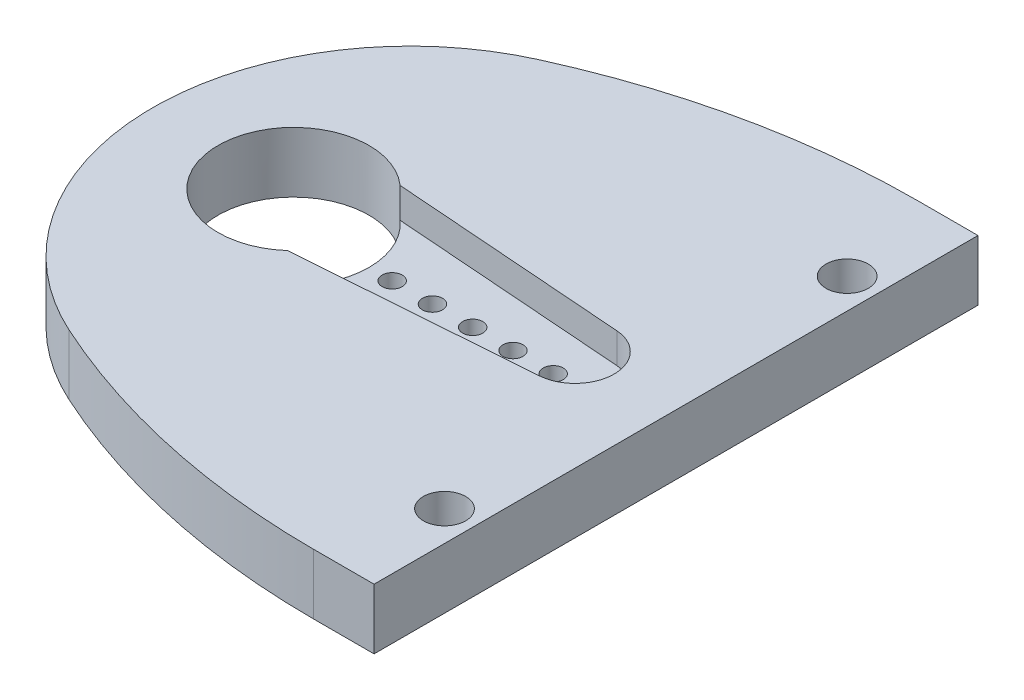
ISO-10303-21;
HEADER;
FILE_DESCRIPTION(('STEP AP214'),'2;1');
FILE_NAME('part.step','',(''),(''),'','','');
FILE_SCHEMA(('AUTOMOTIVE_DESIGN { 1 0 10303 214 1 1 1 1 }'));
ENDSEC;
DATA;
#1=APPLICATION_CONTEXT('core data for automotive mechanical design processes');
#2=APPLICATION_PROTOCOL_DEFINITION('international standard','automotive_design',2000,#1);
#3=PRODUCT_CONTEXT('',#1,'mechanical');
#4=PRODUCT('Part','Part','',(#3));
#5=PRODUCT_RELATED_PRODUCT_CATEGORY('part','',(#4));
#6=PRODUCT_DEFINITION_FORMATION('','',#4);
#7=PRODUCT_DEFINITION_CONTEXT('part definition',#1,'design');
#8=PRODUCT_DEFINITION('design','',#6,#7);
#9=PRODUCT_DEFINITION_SHAPE('','',#8);
#10=(LENGTH_UNIT() NAMED_UNIT(*) SI_UNIT(.MILLI.,.METRE.));
#11=(NAMED_UNIT(*) PLANE_ANGLE_UNIT() SI_UNIT($,.RADIAN.));
#12=(NAMED_UNIT(*) SI_UNIT($,.STERADIAN.) SOLID_ANGLE_UNIT());
#13=UNCERTAINTY_MEASURE_WITH_UNIT(LENGTH_MEASURE(1.E-05),#10,'distance_accuracy_value','');
#14=(GEOMETRIC_REPRESENTATION_CONTEXT(3) GLOBAL_UNCERTAINTY_ASSIGNED_CONTEXT((#13)) GLOBAL_UNIT_ASSIGNED_CONTEXT((#10,
#11,#12)) REPRESENTATION_CONTEXT('',''));
#15=CARTESIAN_POINT('',(0.,0.,0.));
#16=DIRECTION('',(0.,0.,1.));
#17=DIRECTION('',(1.,0.,0.));
#18=AXIS2_PLACEMENT_3D('',#15,#16,#17);
#19=CARTESIAN_POINT('',(16.,-3.,22.4770601851531));
#20=DIRECTION('',(0.,1.,0.));
#21=DIRECTION('',(0.,0.,1.));
#22=AXIS2_PLACEMENT_3D('',#19,#20,#21);
#23=CYLINDRICAL_SURFACE('',#22,37.4770601851531);
#24=CARTESIAN_POINT('',(16.,0.,22.4770601851531));
#25=DIRECTION('',(0.,1.,0.));
#26=DIRECTION('',(0.,0.,1.));
#27=AXIS2_PLACEMENT_3D('',#24,#25,#26);
#28=CIRCLE('',#27,37.4770601851531);
#29=CARTESIAN_POINT('',(16.,0.,-15.));
#30=VERTEX_POINT('',#29);
#31=CARTESIAN_POINT('',(0.500000000000023,0.,-11.644487847162));
#32=VERTEX_POINT('',#31);
#33=EDGE_CURVE('E143',#30,#32,#28,.T.);
#34=ORIENTED_EDGE('',*,*,#33,.F.);
#35=DIRECTION('',(0.,1.,0.));
#36=VECTOR('',#35,1.);
#37=CARTESIAN_POINT('',(16.,-3.,-15.));
#38=LINE('',#37,#36);
#39=CARTESIAN_POINT('',(16.,-3.,-15.));
#40=VERTEX_POINT('',#39);
#41=EDGE_CURVE('E11',#40,#30,#38,.T.);
#42=ORIENTED_EDGE('',*,*,#41,.F.);
#43=CARTESIAN_POINT('',(16.,-3.,22.4770601851531));
#44=DIRECTION('',(0.,1.,0.));
#45=DIRECTION('',(0.,0.,1.));
#46=AXIS2_PLACEMENT_3D('',#43,#44,#45);
#47=CIRCLE('',#46,37.4770601851531);
#48=CARTESIAN_POINT('',(0.500000000000023,-3.,-11.644487847162));
#49=VERTEX_POINT('',#48);
#50=EDGE_CURVE('E163',#40,#49,#47,.T.);
#51=ORIENTED_EDGE('',*,*,#50,.T.);
#52=DIRECTION('',(0.,1.,0.));
#53=VECTOR('',#52,1.);
#54=CARTESIAN_POINT('',(0.500000000000023,-3.,-11.644487847162));
#55=LINE('',#54,#53);
#56=EDGE_CURVE('E93',#49,#32,#55,.T.);
#57=ORIENTED_EDGE('',*,*,#56,.T.);
#58=EDGE_LOOP('',(#34,#42,#51,#57));
#59=FACE_BOUND('',#58,.T.);
#60=ADVANCED_FACE('F35',(#59),#23,.T.);
#61=CARTESIAN_POINT('',(0.,-3.,-15.));
#62=DIRECTION('',(0.,0.,1.));
#63=DIRECTION('',(1.,0.,0.));
#64=AXIS2_PLACEMENT_3D('',#61,#62,#63);
#65=PLANE('',#64);
#66=DIRECTION('',(1.,0.,0.));
#67=VECTOR('',#66,1.);
#68=CARTESIAN_POINT('',(0.,0.,-15.));
#69=LINE('',#68,#67);
#70=CARTESIAN_POINT('',(19.,0.,-15.));
#71=VERTEX_POINT('',#70);
#72=EDGE_CURVE('E156',#30,#71,#69,.T.);
#73=ORIENTED_EDGE('',*,*,#72,.T.);
#74=DIRECTION('',(0.,1.,0.));
#75=VECTOR('',#74,1.);
#76=CARTESIAN_POINT('',(19.,-3.,-15.));
#77=LINE('',#76,#75);
#78=CARTESIAN_POINT('',(19.,-3.,-15.));
#79=VERTEX_POINT('',#78);
#80=EDGE_CURVE('E45',#79,#71,#77,.T.);
#81=ORIENTED_EDGE('',*,*,#80,.F.);
#82=DIRECTION('',(1.,0.,0.));
#83=VECTOR('',#82,1.);
#84=CARTESIAN_POINT('',(0.,-3.,-15.));
#85=LINE('',#84,#83);
#86=EDGE_CURVE('E114',#40,#79,#85,.T.);
#87=ORIENTED_EDGE('',*,*,#86,.F.);
#88=ORIENTED_EDGE('',*,*,#41,.T.);
#89=EDGE_LOOP('',(#73,#81,#87,#88));
#90=FACE_BOUND('',#89,.T.);
#91=ADVANCED_FACE('F209',(#90),#65,.F.);
#92=CARTESIAN_POINT('',(19.,-3.,0.));
#93=DIRECTION('',(-1.,0.,0.));
#94=DIRECTION('',(0.,0.,1.));
#95=AXIS2_PLACEMENT_3D('',#92,#93,#94);
#96=PLANE('',#95);
#97=DIRECTION('',(0.,0.,1.));
#98=VECTOR('',#97,1.);
#99=CARTESIAN_POINT('',(19.,0.,0.));
#100=LINE('',#99,#98);
#101=CARTESIAN_POINT('',(19.,0.,15.));
#102=VERTEX_POINT('',#101);
#103=EDGE_CURVE('E122',#71,#102,#100,.T.);
#104=ORIENTED_EDGE('',*,*,#103,.T.);
#105=DIRECTION('',(0.,1.,0.));
#106=VECTOR('',#105,1.);
#107=CARTESIAN_POINT('',(19.,-3.,15.));
#108=LINE('',#107,#106);
#109=CARTESIAN_POINT('',(19.,-3.,15.));
#110=VERTEX_POINT('',#109);
#111=EDGE_CURVE('E120',#110,#102,#108,.T.);
#112=ORIENTED_EDGE('',*,*,#111,.F.);
#113=DIRECTION('',(0.,0.,1.));
#114=VECTOR('',#113,1.);
#115=CARTESIAN_POINT('',(19.,-3.,0.));
#116=LINE('',#115,#114);
#117=EDGE_CURVE('E107',#79,#110,#116,.T.);
#118=ORIENTED_EDGE('',*,*,#117,.F.);
#119=ORIENTED_EDGE('',*,*,#80,.T.);
#120=EDGE_LOOP('',(#104,#112,#118,#119));
#121=FACE_BOUND('',#120,.T.);
#122=ADVANCED_FACE('F121',(#121),#96,.F.);
#123=CARTESIAN_POINT('',(0.,-3.,15.));
#124=DIRECTION('',(0.,0.,1.));
#125=DIRECTION('',(1.,0.,0.));
#126=AXIS2_PLACEMENT_3D('',#123,#124,#125);
#127=PLANE('',#126);
#128=DIRECTION('',(1.,0.,0.));
#129=VECTOR('',#128,1.);
#130=CARTESIAN_POINT('',(0.,0.,15.));
#131=LINE('',#130,#129);
#132=CARTESIAN_POINT('',(16.,0.,15.));
#133=VERTEX_POINT('',#132);
#134=EDGE_CURVE('E153',#133,#102,#131,.T.);
#135=ORIENTED_EDGE('',*,*,#134,.F.);
#136=DIRECTION('',(0.,1.,0.));
#137=VECTOR('',#136,1.);
#138=CARTESIAN_POINT('',(16.,-3.,15.));
#139=LINE('',#138,#137);
#140=CARTESIAN_POINT('',(16.,-3.,15.));
#141=VERTEX_POINT('',#140);
#142=EDGE_CURVE('E126',#141,#133,#139,.T.);
#143=ORIENTED_EDGE('',*,*,#142,.F.);
#144=DIRECTION('',(1.,0.,0.));
#145=VECTOR('',#144,1.);
#146=CARTESIAN_POINT('',(0.,-3.,15.));
#147=LINE('',#146,#145);
#148=EDGE_CURVE('E113',#141,#110,#147,.T.);
#149=ORIENTED_EDGE('',*,*,#148,.T.);
#150=ORIENTED_EDGE('',*,*,#111,.T.);
#151=EDGE_LOOP('',(#135,#143,#149,#150));
#152=FACE_BOUND('',#151,.T.);
#153=ADVANCED_FACE('F128',(#152),#127,.T.);
#154=CARTESIAN_POINT('',(16.,-3.,-22.4770601851531));
#155=DIRECTION('',(0.,1.,0.));
#156=DIRECTION('',(0.,0.,1.));
#157=AXIS2_PLACEMENT_3D('',#154,#155,#156);
#158=CYLINDRICAL_SURFACE('',#157,37.4770601851531);
#159=CARTESIAN_POINT('',(16.,0.,-22.4770601851531));
#160=DIRECTION('',(0.,1.,0.));
#161=DIRECTION('',(0.,0.,1.));
#162=AXIS2_PLACEMENT_3D('',#159,#160,#161);
#163=CIRCLE('',#162,37.4770601851531);
#164=CARTESIAN_POINT('',(0.500000000000023,0.,11.644487847162));
#165=VERTEX_POINT('',#164);
#166=EDGE_CURVE('E150',#133,#165,#163,.F.);
#167=ORIENTED_EDGE('',*,*,#166,.T.);
#168=DIRECTION('',(0.,1.,0.));
#169=VECTOR('',#168,1.);
#170=CARTESIAN_POINT('',(0.500000000000023,-3.,11.644487847162));
#171=LINE('',#170,#169);
#172=CARTESIAN_POINT('',(0.500000000000023,-3.,11.644487847162));
#173=VERTEX_POINT('',#172);
#174=EDGE_CURVE('E167',#173,#165,#171,.T.);
#175=ORIENTED_EDGE('',*,*,#174,.F.);
#176=CARTESIAN_POINT('',(16.,-3.,-22.4770601851531));
#177=DIRECTION('',(0.,1.,0.));
#178=DIRECTION('',(0.,0.,1.));
#179=AXIS2_PLACEMENT_3D('',#176,#177,#178);
#180=CIRCLE('',#179,37.4770601851531);
#181=EDGE_CURVE('E130',#141,#173,#180,.F.);
#182=ORIENTED_EDGE('',*,*,#181,.F.);
#183=ORIENTED_EDGE('',*,*,#142,.T.);
#184=EDGE_LOOP('',(#167,#175,#182,#183));
#185=FACE_BOUND('',#184,.T.);
#186=ADVANCED_FACE('F223',(#185),#158,.T.);
#187=CARTESIAN_POINT('',(17.5,-3.,-10.));
#188=DIRECTION('',(0.,1.,0.));
#189=DIRECTION('',(0.,0.,1.));
#190=AXIS2_PLACEMENT_3D('',#187,#188,#189);
#191=CYLINDRICAL_SURFACE('',#190,1.05);
#192=CARTESIAN_POINT('',(17.5,-3.,-10.));
#193=DIRECTION('',(0.,1.,0.));
#194=DIRECTION('',(0.,0.,1.));
#195=AXIS2_PLACEMENT_3D('',#192,#193,#194);
#196=CIRCLE('',#195,1.05);
#197=CARTESIAN_POINT('',(17.5,-3.,-8.95));
#198=VERTEX_POINT('',#197);
#199=EDGE_CURVE('E137',#198,#198,#196,.T.);
#200=ORIENTED_EDGE('',*,*,#199,.F.);
#201=EDGE_LOOP('',(#200));
#202=FACE_BOUND('',#201,.T.);
#203=CARTESIAN_POINT('',(17.5,0.,-10.));
#204=DIRECTION('',(0.,1.,0.));
#205=DIRECTION('',(0.,0.,1.));
#206=AXIS2_PLACEMENT_3D('',#203,#204,#205);
#207=CIRCLE('',#206,1.05);
#208=CARTESIAN_POINT('',(17.5,0.,-8.95));
#209=VERTEX_POINT('',#208);
#210=EDGE_CURVE('E158',#209,#209,#207,.T.);
#211=ORIENTED_EDGE('',*,*,#210,.T.);
#212=EDGE_LOOP('',(#211));
#213=FACE_BOUND('',#212,.T.);
#214=ADVANCED_FACE('F218',(#202,#213),#191,.F.);
#215=CARTESIAN_POINT('',(5.7896064815136,-3.,0.));
#216=DIRECTION('',(0.,1.,0.));
#217=DIRECTION('',(0.,0.,1.));
#218=AXIS2_PLACEMENT_3D('',#215,#216,#217);
#219=CYLINDRICAL_SURFACE('',#218,12.7896064815136);
#220=CARTESIAN_POINT('',(5.7896064815136,0.,0.));
#221=DIRECTION('',(0.,1.,0.));
#222=DIRECTION('',(0.,0.,1.));
#223=AXIS2_PLACEMENT_3D('',#220,#221,#222);
#224=CIRCLE('',#223,12.7896064815136);
#225=EDGE_CURVE('E146',#32,#165,#224,.T.);
#226=ORIENTED_EDGE('',*,*,#225,.F.);
#227=ORIENTED_EDGE('',*,*,#56,.F.);
#228=CARTESIAN_POINT('',(5.7896064815136,-3.,0.));
#229=DIRECTION('',(0.,1.,0.));
#230=DIRECTION('',(0.,0.,1.));
#231=AXIS2_PLACEMENT_3D('',#228,#229,#230);
#232=CIRCLE('',#231,12.7896064815136);
#233=EDGE_CURVE('E132',#49,#173,#232,.T.);
#234=ORIENTED_EDGE('',*,*,#233,.T.);
#235=ORIENTED_EDGE('',*,*,#174,.T.);
#236=EDGE_LOOP('',(#226,#227,#234,#235));
#237=FACE_BOUND('',#236,.T.);
#238=ADVANCED_FACE('F205',(#237),#219,.T.);
#239=CARTESIAN_POINT('',(17.5,-3.,10.));
#240=DIRECTION('',(0.,1.,0.));
#241=DIRECTION('',(0.,0.,1.));
#242=AXIS2_PLACEMENT_3D('',#239,#240,#241);
#243=CYLINDRICAL_SURFACE('',#242,1.05);
#244=CARTESIAN_POINT('',(17.5,-3.,10.));
#245=DIRECTION('',(0.,1.,0.));
#246=DIRECTION('',(0.,0.,1.));
#247=AXIS2_PLACEMENT_3D('',#244,#245,#246);
#248=CIRCLE('',#247,1.05);
#249=CARTESIAN_POINT('',(17.5,-3.,11.05));
#250=VERTEX_POINT('',#249);
#251=EDGE_CURVE('E140',#250,#250,#248,.F.);
#252=ORIENTED_EDGE('',*,*,#251,.T.);
#253=EDGE_LOOP('',(#252));
#254=FACE_BOUND('',#253,.T.);
#255=CARTESIAN_POINT('',(17.5,0.,10.));
#256=DIRECTION('',(0.,1.,0.));
#257=DIRECTION('',(0.,0.,1.));
#258=AXIS2_PLACEMENT_3D('',#255,#256,#257);
#259=CIRCLE('',#258,1.05);
#260=CARTESIAN_POINT('',(17.5,0.,11.05));
#261=VERTEX_POINT('',#260);
#262=EDGE_CURVE('E161',#261,#261,#259,.F.);
#263=ORIENTED_EDGE('',*,*,#262,.F.);
#264=EDGE_LOOP('',(#263));
#265=FACE_BOUND('',#264,.T.);
#266=ADVANCED_FACE('F227',(#254,#265),#243,.F.);
#267=CARTESIAN_POINT('',(0.,-3.,0.));
#268=DIRECTION('',(0.,1.,0.));
#269=DIRECTION('',(0.,0.,1.));
#270=AXIS2_PLACEMENT_3D('',#267,#268,#269);
#271=PLANE('',#270);
#272=CARTESIAN_POINT('',(12.9,-3.,0.));
#273=DIRECTION('',(0.,1.,0.));
#274=DIRECTION('',(0.,0.,1.));
#275=AXIS2_PLACEMENT_3D('',#272,#273,#274);
#276=CIRCLE('',#275,0.5);
#277=CARTESIAN_POINT('',(12.9,-3.,0.500000000000005));
#278=VERTEX_POINT('',#277);
#279=EDGE_CURVE('E336',#278,#278,#276,.T.);
#280=ORIENTED_EDGE('',*,*,#279,.T.);
#281=EDGE_LOOP('',(#280));
#282=FACE_BOUND('',#281,.T.);
#283=CARTESIAN_POINT('',(10.9,-3.,0.));
#284=DIRECTION('',(0.,1.,0.));
#285=DIRECTION('',(0.,0.,1.));
#286=AXIS2_PLACEMENT_3D('',#283,#284,#285);
#287=CIRCLE('',#286,0.5);
#288=CARTESIAN_POINT('',(10.9,-3.,0.500000000000004));
#289=VERTEX_POINT('',#288);
#290=EDGE_CURVE('E344',#289,#289,#287,.T.);
#291=ORIENTED_EDGE('',*,*,#290,.T.);
#292=EDGE_LOOP('',(#291));
#293=FACE_BOUND('',#292,.T.);
#294=CARTESIAN_POINT('',(8.9,-3.,0.));
#295=DIRECTION('',(0.,1.,0.));
#296=DIRECTION('',(0.,0.,1.));
#297=AXIS2_PLACEMENT_3D('',#294,#295,#296);
#298=CIRCLE('',#297,0.5);
#299=CARTESIAN_POINT('',(8.9,-3.,0.500000000000004));
#300=VERTEX_POINT('',#299);
#301=EDGE_CURVE('E350',#300,#300,#298,.T.);
#302=ORIENTED_EDGE('',*,*,#301,.T.);
#303=EDGE_LOOP('',(#302));
#304=FACE_BOUND('',#303,.T.);
#305=CARTESIAN_POINT('',(6.9,-3.,0.));
#306=DIRECTION('',(0.,1.,0.));
#307=DIRECTION('',(0.,0.,1.));
#308=AXIS2_PLACEMENT_3D('',#305,#306,#307);
#309=CIRCLE('',#308,0.5);
#310=CARTESIAN_POINT('',(6.9,-3.,0.500000000000004));
#311=VERTEX_POINT('',#310);
#312=EDGE_CURVE('E356',#311,#311,#309,.T.);
#313=ORIENTED_EDGE('',*,*,#312,.T.);
#314=EDGE_LOOP('',(#313));
#315=FACE_BOUND('',#314,.T.);
#316=CARTESIAN_POINT('',(4.9,-3.,0.));
#317=DIRECTION('',(0.,1.,0.));
#318=DIRECTION('',(0.,0.,1.));
#319=AXIS2_PLACEMENT_3D('',#316,#317,#318);
#320=CIRCLE('',#319,0.5);
#321=CARTESIAN_POINT('',(4.9,-3.,0.500000000000004));
#322=VERTEX_POINT('',#321);
#323=EDGE_CURVE('E362',#322,#322,#320,.T.);
#324=ORIENTED_EDGE('',*,*,#323,.T.);
#325=EDGE_LOOP('',(#324));
#326=FACE_BOUND('',#325,.T.);
#327=CARTESIAN_POINT('',(0.,-3.,0.));
#328=DIRECTION('',(0.,1.,0.));
#329=DIRECTION('',(0.,0.,1.));
#330=AXIS2_PLACEMENT_3D('',#327,#328,#329);
#331=CIRCLE('',#330,3.75);
#332=CARTESIAN_POINT('',(0.,-3.,3.75));
#333=VERTEX_POINT('',#332);
#334=EDGE_CURVE('E194',#333,#333,#331,.T.);
#335=ORIENTED_EDGE('',*,*,#334,.T.);
#336=EDGE_LOOP('',(#335));
#337=FACE_BOUND('',#336,.T.);
#338=ORIENTED_EDGE('',*,*,#50,.F.);
#339=ORIENTED_EDGE('',*,*,#86,.T.);
#340=ORIENTED_EDGE('',*,*,#117,.T.);
#341=ORIENTED_EDGE('',*,*,#148,.F.);
#342=ORIENTED_EDGE('',*,*,#181,.T.);
#343=ORIENTED_EDGE('',*,*,#233,.F.);
#344=EDGE_LOOP('',(#338,#339,#340,#341,#342,#343));
#345=FACE_BOUND('',#344,.T.);
#346=ORIENTED_EDGE('',*,*,#199,.T.);
#347=EDGE_LOOP('',(#346));
#348=FACE_BOUND('',#347,.T.);
#349=ORIENTED_EDGE('',*,*,#251,.F.);
#350=EDGE_LOOP('',(#349));
#351=FACE_BOUND('',#350,.T.);
#352=ADVANCED_FACE('F110',(#282,#293,#304,#315,#326,#337,#345,#348,#351),#271,.F.);
#353=CARTESIAN_POINT('',(0.,0.,0.));
#354=DIRECTION('',(0.,1.,0.));
#355=DIRECTION('',(0.,0.,1.));
#356=AXIS2_PLACEMENT_3D('',#353,#354,#355);
#357=PLANE('',#356);
#358=CARTESIAN_POINT('',(0.,0.,0.));
#359=DIRECTION('',(0.,1.,0.));
#360=DIRECTION('',(0.,0.,1.));
#361=AXIS2_PLACEMENT_3D('',#358,#359,#360);
#362=CIRCLE('',#361,3.75);
#363=CARTESIAN_POINT('',(2.49449393665328,0.,-2.8));
#364=VERTEX_POINT('',#363);
#365=CARTESIAN_POINT('',(2.49449393665328,0.,2.8));
#366=VERTEX_POINT('',#365);
#367=EDGE_CURVE('E53',#364,#366,#362,.T.);
#368=ORIENTED_EDGE('',*,*,#367,.F.);
#369=DIRECTION('',(-0.997231667992043,0.,-0.0743572481591926));
#370=VECTOR('',#369,1.);
#371=CARTESIAN_POINT('',(14.1314068018781,0.,-1.93230912585366));
#372=LINE('',#371,#370);
#373=CARTESIAN_POINT('',(14.1314068018781,0.,-1.93230912585366));
#374=VERTEX_POINT('',#373);
#375=EDGE_CURVE('E182',#374,#364,#372,.T.);
#376=ORIENTED_EDGE('',*,*,#375,.F.);
#377=CARTESIAN_POINT('',(14.1314068018781,0.,1.93230912585367));
#378=CARTESIAN_POINT('',(14.4972861283963,0.,1.90483521565681));
#379=CARTESIAN_POINT('',(14.8274919542049,0.,1.74605270556739));
#380=CARTESIAN_POINT('',(15.1573380255282,0.,1.58744318673294));
#381=CARTESIAN_POINT('',(15.4071548811686,0.,1.3185847338687));
#382=CARTESIAN_POINT('',(15.6562007373171,0.,1.05055604779515));
#383=CARTESIAN_POINT('',(15.7905620157033,0.,0.709168668193903));
#384=CARTESIAN_POINT('',(15.9249037196163,0.,0.367831023741005));
#385=CARTESIAN_POINT('',(15.925,0.,0.));
#386=CARTESIAN_POINT('',(15.9250958469899,0.,-0.366175279411282));
#387=CARTESIAN_POINT('',(15.7910181757352,0.,-0.70800767238383));
#388=CARTESIAN_POINT('',(15.6573741868926,0.,-1.04873438761509));
#389=CARTESIAN_POINT('',(15.407835717414,0.,-1.31785124196447));
#390=CARTESIAN_POINT('',(15.1590673882685,0.,-1.58613753201543));
#391=CARTESIAN_POINT('',(14.8286158171884,0.,-1.74551147988432));
#392=CARTESIAN_POINT('',(14.4984494979519,0.,-1.90474785324479));
#393=CARTESIAN_POINT('',(14.1314068018781,0.,-1.93230912585366));
#394=B_SPLINE_CURVE_WITH_KNOTS('',2,(#377,#378,#379,#380,#381,#382,#383,#384,#385,#386,#387,
#388,#389,#390,#391,#392,#393),.UNSPECIFIED.,.F.,.F.,(3,2,2,2,2,2,2,2,3),(0.,0.125,0.25,0.375,
0.5,0.625,0.75,0.875,1.),.UNSPECIFIED.);
#395=CARTESIAN_POINT('',(14.1314068018781,0.,1.93230912585367));
#396=VERTEX_POINT('',#395);
#397=EDGE_CURVE('E175',#396,#374,#394,.T.);
#398=ORIENTED_EDGE('',*,*,#397,.F.);
#399=DIRECTION('',(0.997231667992043,0.,-0.0743572481591925));
#400=VECTOR('',#399,1.);
#401=CARTESIAN_POINT('',(2.49449393665328,0.,2.8));
#402=LINE('',#401,#400);
#403=EDGE_CURVE('E179',#366,#396,#402,.T.);
#404=ORIENTED_EDGE('',*,*,#403,.F.);
#405=EDGE_LOOP('',(#368,#376,#398,#404));
#406=FACE_BOUND('',#405,.T.);
#407=ORIENTED_EDGE('',*,*,#33,.T.);
#408=ORIENTED_EDGE('',*,*,#225,.T.);
#409=ORIENTED_EDGE('',*,*,#166,.F.);
#410=ORIENTED_EDGE('',*,*,#134,.T.);
#411=ORIENTED_EDGE('',*,*,#103,.F.);
#412=ORIENTED_EDGE('',*,*,#72,.F.);
#413=EDGE_LOOP('',(#407,#408,#409,#410,#411,#412));
#414=FACE_BOUND('',#413,.T.);
#415=ORIENTED_EDGE('',*,*,#210,.F.);
#416=EDGE_LOOP('',(#415));
#417=FACE_BOUND('',#416,.T.);
#418=ORIENTED_EDGE('',*,*,#262,.T.);
#419=EDGE_LOOP('',(#418));
#420=FACE_BOUND('',#419,.T.);
#421=ADVANCED_FACE('F176',(#406,#414,#417,#420),#357,.T.);
#422=CARTESIAN_POINT('',(0.,-1.5,0.));
#423=DIRECTION('',(0.,1.,0.));
#424=DIRECTION('',(0.,0.,1.));
#425=AXIS2_PLACEMENT_3D('',#422,#423,#424);
#426=PLANE('',#425);
#427=CARTESIAN_POINT('',(12.9,-1.5,0.));
#428=DIRECTION('',(0.,1.,0.));
#429=DIRECTION('',(0.,0.,1.));
#430=AXIS2_PLACEMENT_3D('',#427,#428,#429);
#431=CIRCLE('',#430,0.5);
#432=CARTESIAN_POINT('',(12.9,-1.5,0.500000000000005));
#433=VERTEX_POINT('',#432);
#434=EDGE_CURVE('E339',#433,#433,#431,.T.);
#435=ORIENTED_EDGE('',*,*,#434,.F.);
#436=EDGE_LOOP('',(#435));
#437=FACE_BOUND('',#436,.T.);
#438=CARTESIAN_POINT('',(10.9,-1.5,0.));
#439=DIRECTION('',(0.,1.,0.));
#440=DIRECTION('',(0.,0.,1.));
#441=AXIS2_PLACEMENT_3D('',#438,#439,#440);
#442=CIRCLE('',#441,0.5);
#443=CARTESIAN_POINT('',(10.9,-1.5,0.500000000000004));
#444=VERTEX_POINT('',#443);
#445=EDGE_CURVE('E341',#444,#444,#442,.T.);
#446=ORIENTED_EDGE('',*,*,#445,.F.);
#447=EDGE_LOOP('',(#446));
#448=FACE_BOUND('',#447,.T.);
#449=CARTESIAN_POINT('',(8.9,-1.5,0.));
#450=DIRECTION('',(0.,1.,0.));
#451=DIRECTION('',(0.,0.,1.));
#452=AXIS2_PLACEMENT_3D('',#449,#450,#451);
#453=CIRCLE('',#452,0.5);
#454=CARTESIAN_POINT('',(8.9,-1.5,0.500000000000004));
#455=VERTEX_POINT('',#454);
#456=EDGE_CURVE('E347',#455,#455,#453,.T.);
#457=ORIENTED_EDGE('',*,*,#456,.F.);
#458=EDGE_LOOP('',(#457));
#459=FACE_BOUND('',#458,.T.);
#460=CARTESIAN_POINT('',(6.9,-1.5,0.));
#461=DIRECTION('',(0.,1.,0.));
#462=DIRECTION('',(0.,0.,1.));
#463=AXIS2_PLACEMENT_3D('',#460,#461,#462);
#464=CIRCLE('',#463,0.5);
#465=CARTESIAN_POINT('',(6.9,-1.5,0.500000000000004));
#466=VERTEX_POINT('',#465);
#467=EDGE_CURVE('E353',#466,#466,#464,.T.);
#468=ORIENTED_EDGE('',*,*,#467,.F.);
#469=EDGE_LOOP('',(#468));
#470=FACE_BOUND('',#469,.T.);
#471=CARTESIAN_POINT('',(4.9,-1.5,0.));
#472=DIRECTION('',(0.,1.,0.));
#473=DIRECTION('',(0.,0.,1.));
#474=AXIS2_PLACEMENT_3D('',#471,#472,#473);
#475=CIRCLE('',#474,0.5);
#476=CARTESIAN_POINT('',(4.9,-1.5,0.500000000000004));
#477=VERTEX_POINT('',#476);
#478=EDGE_CURVE('E359',#477,#477,#475,.T.);
#479=ORIENTED_EDGE('',*,*,#478,.F.);
#480=EDGE_LOOP('',(#479));
#481=FACE_BOUND('',#480,.T.);
#482=CARTESIAN_POINT('',(0.,-1.5,0.));
#483=DIRECTION('',(0.,1.,0.));
#484=DIRECTION('',(0.,0.,1.));
#485=AXIS2_PLACEMENT_3D('',#482,#483,#484);
#486=CIRCLE('',#485,3.75);
#487=CARTESIAN_POINT('',(2.49449393665327,-1.5,2.80000000000001));
#488=VERTEX_POINT('',#487);
#489=CARTESIAN_POINT('',(2.49449393665328,-1.5,-2.8));
#490=VERTEX_POINT('',#489);
#491=EDGE_CURVE('E272',#488,#490,#486,.T.);
#492=ORIENTED_EDGE('',*,*,#491,.F.);
#493=DIRECTION('',(0.997231667992043,0.,-0.0743572481591925));
#494=VECTOR('',#493,1.);
#495=CARTESIAN_POINT('',(2.49449393665328,-1.5,2.8));
#496=LINE('',#495,#494);
#497=CARTESIAN_POINT('',(14.1314068018781,-1.5,1.93230912585367));
#498=VERTEX_POINT('',#497);
#499=EDGE_CURVE('E189',#488,#498,#496,.T.);
#500=ORIENTED_EDGE('',*,*,#499,.T.);
#501=CARTESIAN_POINT('',(14.1314068018781,-1.5,-1.93230912585366));
#502=CARTESIAN_POINT('',(14.4984494979519,-1.5,-1.90474785324479));
#503=CARTESIAN_POINT('',(14.8286158171884,-1.5,-1.74551147988432));
#504=CARTESIAN_POINT('',(15.1590673882685,-1.5,-1.58613753201543));
#505=CARTESIAN_POINT('',(15.407835717414,-1.5,-1.31785124196447));
#506=CARTESIAN_POINT('',(15.6573741868926,-1.5,-1.04873438761509));
#507=CARTESIAN_POINT('',(15.7910181757352,-1.5,-0.70800767238383));
#508=CARTESIAN_POINT('',(15.9250958469899,-1.5,-0.366175279411282));
#509=CARTESIAN_POINT('',(15.925,-1.5,0.));
#510=CARTESIAN_POINT('',(15.9249037196163,-1.5,0.367831023741005));
#511=CARTESIAN_POINT('',(15.7905620157033,-1.5,0.709168668193903));
#512=CARTESIAN_POINT('',(15.6562007373171,-1.5,1.05055604779515));
#513=CARTESIAN_POINT('',(15.4071548811686,-1.5,1.3185847338687));
#514=CARTESIAN_POINT('',(15.1573380255282,-1.5,1.58744318673294));
#515=CARTESIAN_POINT('',(14.8274919542049,-1.5,1.74605270556739));
#516=CARTESIAN_POINT('',(14.4972861283963,-1.5,1.90483521565681));
#517=CARTESIAN_POINT('',(14.1314068018781,-1.5,1.93230912585367));
#518=B_SPLINE_CURVE_WITH_KNOTS('',2,(#501,#502,#503,#504,#505,#506,#507,#508,#509,#510,#511,
#512,#513,#514,#515,#516,#517),.UNSPECIFIED.,.F.,.F.,(3,2,2,2,2,2,2,2,3),(0.,0.125,0.25,0.375,
0.5,0.625,0.75,0.875,1.),.UNSPECIFIED.);
#519=CARTESIAN_POINT('',(14.1314068018781,-1.5,-1.93230912585366));
#520=VERTEX_POINT('',#519);
#521=EDGE_CURVE('E287',#498,#520,#518,.F.);
#522=ORIENTED_EDGE('',*,*,#521,.T.);
#523=DIRECTION('',(-0.997231667992043,0.,-0.0743572481591926));
#524=VECTOR('',#523,1.);
#525=CARTESIAN_POINT('',(14.1314068018781,-1.5,-1.93230912585366));
#526=LINE('',#525,#524);
#527=EDGE_CURVE('E283',#520,#490,#526,.T.);
#528=ORIENTED_EDGE('',*,*,#527,.T.);
#529=EDGE_LOOP('',(#492,#500,#522,#528));
#530=FACE_BOUND('',#529,.T.);
#531=ADVANCED_FACE('F241',(#437,#448,#459,#470,#481,#530),#426,.T.);
#532=CARTESIAN_POINT('',(0.,-1.5,0.));
#533=DIRECTION('',(0.,1.,0.));
#534=DIRECTION('',(0.,0.,1.));
#535=AXIS2_PLACEMENT_3D('',#532,#533,#534);
#536=CYLINDRICAL_SURFACE('',#535,3.75);
#537=ORIENTED_EDGE('',*,*,#367,.T.);
#538=DIRECTION('',(0.,1.,0.));
#539=VECTOR('',#538,1.);
#540=CARTESIAN_POINT('',(2.49449393665328,-1.5,2.8));
#541=LINE('',#540,#539);
#542=EDGE_CURVE('E280',#488,#366,#541,.T.);
#543=ORIENTED_EDGE('',*,*,#542,.F.);
#544=ORIENTED_EDGE('',*,*,#491,.T.);
#545=DIRECTION('',(0.,1.,0.));
#546=VECTOR('',#545,1.);
#547=CARTESIAN_POINT('',(2.49449393665328,-1.5,-2.8));
#548=LINE('',#547,#546);
#549=EDGE_CURVE('E147',#490,#364,#548,.T.);
#550=ORIENTED_EDGE('',*,*,#549,.T.);
#551=EDGE_LOOP('',(#537,#543,#544,#550));
#552=FACE_BOUND('',#551,.T.);
#553=ORIENTED_EDGE('',*,*,#334,.F.);
#554=EDGE_LOOP('',(#553));
#555=FACE_BOUND('',#554,.T.);
#556=ADVANCED_FACE('F248',(#552,#555),#536,.F.);
#557=CARTESIAN_POINT('',(14.1314068018781,-1.5,-1.93230912585366));
#558=DIRECTION('',(0.0743572481591926,0.,-0.997231667992043));
#559=DIRECTION('',(-0.997231667992043,0.,-0.0743572481591926));
#560=AXIS2_PLACEMENT_3D('',#557,#558,#559);
#561=PLANE('',#560);
#562=ORIENTED_EDGE('',*,*,#375,.T.);
#563=ORIENTED_EDGE('',*,*,#549,.F.);
#564=ORIENTED_EDGE('',*,*,#527,.F.);
#565=DIRECTION('',(0.,1.,0.));
#566=VECTOR('',#565,1.);
#567=CARTESIAN_POINT('',(14.1314068018781,-1.5,-1.93230912585366));
#568=LINE('',#567,#566);
#569=EDGE_CURVE('E279',#520,#374,#568,.T.);
#570=ORIENTED_EDGE('',*,*,#569,.T.);
#571=EDGE_LOOP('',(#562,#563,#564,#570));
#572=FACE_BOUND('',#571,.T.);
#573=ADVANCED_FACE('F257',(#572),#561,.F.);
#574=CARTESIAN_POINT('',(14.1314068018781,-1.5,1.93230912585367));
#575=CARTESIAN_POINT('',(14.4972861283963,-1.5,1.90483521565681));
#576=CARTESIAN_POINT('',(14.8274919542049,-1.5,1.74605270556739));
#577=CARTESIAN_POINT('',(15.1573380255282,-1.5,1.58744318673294));
#578=CARTESIAN_POINT('',(15.4071548811686,-1.5,1.3185847338687));
#579=CARTESIAN_POINT('',(15.6562007373171,-1.5,1.05055604779515));
#580=CARTESIAN_POINT('',(15.7905620157033,-1.5,0.709168668193903));
#581=CARTESIAN_POINT('',(15.9249037196163,-1.5,0.367831023741005));
#582=CARTESIAN_POINT('',(15.925,-1.5,0.));
#583=CARTESIAN_POINT('',(15.9250958469899,-1.5,-0.366175279411282));
#584=CARTESIAN_POINT('',(15.7910181757352,-1.5,-0.70800767238383));
#585=CARTESIAN_POINT('',(15.6573741868926,-1.5,-1.04873438761509));
#586=CARTESIAN_POINT('',(15.407835717414,-1.5,-1.31785124196447));
#587=CARTESIAN_POINT('',(15.1590673882685,-1.5,-1.58613753201543));
#588=CARTESIAN_POINT('',(14.8286158171884,-1.5,-1.74551147988432));
#589=CARTESIAN_POINT('',(14.4984494979519,-1.5,-1.90474785324479));
#590=CARTESIAN_POINT('',(14.1314068018781,-1.5,-1.93230912585366));
#591=B_SPLINE_CURVE_WITH_KNOTS('',2,(#574,#575,#576,#577,#578,#579,#580,#581,#582,#583,#584,
#585,#586,#587,#588,#589,#590),.UNSPECIFIED.,.F.,.F.,(3,2,2,2,2,2,2,2,3),(0.,0.125,0.25,0.375,
0.5,0.625,0.75,0.875,1.),.UNSPECIFIED.);
#592=DIRECTION('',(0.,1.,0.));
#593=VECTOR('',#592,1.);
#594=SURFACE_OF_LINEAR_EXTRUSION('',#591,#593);
#595=ORIENTED_EDGE('',*,*,#397,.T.);
#596=ORIENTED_EDGE('',*,*,#569,.F.);
#597=ORIENTED_EDGE('',*,*,#521,.F.);
#598=DIRECTION('',(0.,1.,0.));
#599=VECTOR('',#598,1.);
#600=CARTESIAN_POINT('',(14.1314068018781,-1.5,1.93230912585367));
#601=LINE('',#600,#599);
#602=EDGE_CURVE('E282',#498,#396,#601,.T.);
#603=ORIENTED_EDGE('',*,*,#602,.T.);
#604=EDGE_LOOP('',(#595,#596,#597,#603));
#605=FACE_BOUND('',#604,.T.);
#606=ADVANCED_FACE('F261',(#605),#594,.F.);
#607=CARTESIAN_POINT('',(2.49449393665328,-1.5,2.8));
#608=DIRECTION('',(0.0743572481591925,0.,0.997231667992043));
#609=DIRECTION('',(0.997231667992043,0.,-0.0743572481591925));
#610=AXIS2_PLACEMENT_3D('',#607,#608,#609);
#611=PLANE('',#610);
#612=ORIENTED_EDGE('',*,*,#403,.T.);
#613=ORIENTED_EDGE('',*,*,#602,.F.);
#614=ORIENTED_EDGE('',*,*,#499,.F.);
#615=ORIENTED_EDGE('',*,*,#542,.T.);
#616=EDGE_LOOP('',(#612,#613,#614,#615));
#617=FACE_BOUND('',#616,.T.);
#618=ADVANCED_FACE('F258',(#617),#611,.F.);
#619=CARTESIAN_POINT('',(4.9,-3.,0.));
#620=DIRECTION('',(0.,1.,0.));
#621=DIRECTION('',(0.,0.,1.));
#622=AXIS2_PLACEMENT_3D('',#619,#620,#621);
#623=CYLINDRICAL_SURFACE('',#622,0.5);
#624=ORIENTED_EDGE('',*,*,#323,.F.);
#625=EDGE_LOOP('',(#624));
#626=FACE_BOUND('',#625,.T.);
#627=ORIENTED_EDGE('',*,*,#478,.T.);
#628=EDGE_LOOP('',(#627));
#629=FACE_BOUND('',#628,.T.);
#630=ADVANCED_FACE('F260',(#626,#629),#623,.F.);
#631=CARTESIAN_POINT('',(6.9,-3.,0.));
#632=DIRECTION('',(0.,1.,0.));
#633=DIRECTION('',(0.,0.,1.));
#634=AXIS2_PLACEMENT_3D('',#631,#632,#633);
#635=CYLINDRICAL_SURFACE('',#634,0.5);
#636=ORIENTED_EDGE('',*,*,#312,.F.);
#637=EDGE_LOOP('',(#636));
#638=FACE_BOUND('',#637,.T.);
#639=ORIENTED_EDGE('',*,*,#467,.T.);
#640=EDGE_LOOP('',(#639));
#641=FACE_BOUND('',#640,.T.);
#642=ADVANCED_FACE('F315',(#638,#641),#635,.F.);
#643=CARTESIAN_POINT('',(8.9,-3.,0.));
#644=DIRECTION('',(0.,1.,0.));
#645=DIRECTION('',(0.,0.,1.));
#646=AXIS2_PLACEMENT_3D('',#643,#644,#645);
#647=CYLINDRICAL_SURFACE('',#646,0.5);
#648=ORIENTED_EDGE('',*,*,#301,.F.);
#649=EDGE_LOOP('',(#648));
#650=FACE_BOUND('',#649,.T.);
#651=ORIENTED_EDGE('',*,*,#456,.T.);
#652=EDGE_LOOP('',(#651));
#653=FACE_BOUND('',#652,.T.);
#654=ADVANCED_FACE('F319',(#650,#653),#647,.F.);
#655=CARTESIAN_POINT('',(10.9,-3.,0.));
#656=DIRECTION('',(0.,1.,0.));
#657=DIRECTION('',(0.,0.,1.));
#658=AXIS2_PLACEMENT_3D('',#655,#656,#657);
#659=CYLINDRICAL_SURFACE('',#658,0.5);
#660=ORIENTED_EDGE('',*,*,#290,.F.);
#661=EDGE_LOOP('',(#660));
#662=FACE_BOUND('',#661,.T.);
#663=ORIENTED_EDGE('',*,*,#445,.T.);
#664=EDGE_LOOP('',(#663));
#665=FACE_BOUND('',#664,.T.);
#666=ADVANCED_FACE('F323',(#662,#665),#659,.F.);
#667=CARTESIAN_POINT('',(12.9,-3.,0.));
#668=DIRECTION('',(0.,1.,0.));
#669=DIRECTION('',(0.,0.,1.));
#670=AXIS2_PLACEMENT_3D('',#667,#668,#669);
#671=CYLINDRICAL_SURFACE('',#670,0.5);
#672=ORIENTED_EDGE('',*,*,#279,.F.);
#673=EDGE_LOOP('',(#672));
#674=FACE_BOUND('',#673,.T.);
#675=ORIENTED_EDGE('',*,*,#434,.T.);
#676=EDGE_LOOP('',(#675));
#677=FACE_BOUND('',#676,.T.);
#678=ADVANCED_FACE('F327',(#674,#677),#671,.F.);
#679=CLOSED_SHELL('',(#60,#91,#122,#153,#186,#214,#238,#266,#352,#421,#531,#556,#573,#606,#618,
#630,#642,#654,#666,#678));
#680=MANIFOLD_SOLID_BREP('B2',#679);
#681=ADVANCED_BREP_SHAPE_REPRESENTATION('',(#18,#680),#14);
#682=SHAPE_DEFINITION_REPRESENTATION(#9,#681);
ENDSEC;
END-ISO-10303-21;
